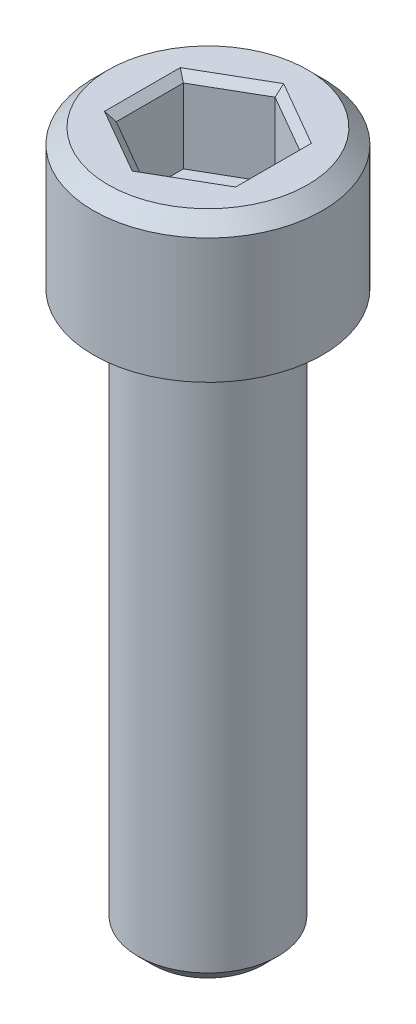
ISO-10303-21;
HEADER;
FILE_DESCRIPTION(('STEP AP214'),'2;1');
FILE_NAME('part.step','',(''),(''),'','','');
FILE_SCHEMA(('AUTOMOTIVE_DESIGN { 1 0 10303 214 1 1 1 1 }'));
ENDSEC;
DATA;
#1=APPLICATION_CONTEXT('core data for automotive mechanical design processes');
#2=APPLICATION_PROTOCOL_DEFINITION('international standard','automotive_design',2000,#1);
#3=PRODUCT_CONTEXT('',#1,'mechanical');
#4=PRODUCT('Part','Part','',(#3));
#5=PRODUCT_RELATED_PRODUCT_CATEGORY('part','',(#4));
#6=PRODUCT_DEFINITION_FORMATION('','',#4);
#7=PRODUCT_DEFINITION_CONTEXT('part definition',#1,'design');
#8=PRODUCT_DEFINITION('design','',#6,#7);
#9=PRODUCT_DEFINITION_SHAPE('','',#8);
#10=(LENGTH_UNIT() NAMED_UNIT(*) SI_UNIT(.MILLI.,.METRE.));
#11=(NAMED_UNIT(*) PLANE_ANGLE_UNIT() SI_UNIT($,.RADIAN.));
#12=(NAMED_UNIT(*) SI_UNIT($,.STERADIAN.) SOLID_ANGLE_UNIT());
#13=UNCERTAINTY_MEASURE_WITH_UNIT(LENGTH_MEASURE(1.E-05),#10,'distance_accuracy_value','');
#14=(GEOMETRIC_REPRESENTATION_CONTEXT(3) GLOBAL_UNCERTAINTY_ASSIGNED_CONTEXT((#13)) GLOBAL_UNIT_ASSIGNED_CONTEXT((#10,
#11,#12)) REPRESENTATION_CONTEXT('',''));
#15=CARTESIAN_POINT('',(0.,0.,0.));
#16=DIRECTION('',(0.,0.,1.));
#17=DIRECTION('',(1.,0.,0.));
#18=AXIS2_PLACEMENT_3D('',#15,#16,#17);
#19=CARTESIAN_POINT('',(0.,-4.77520000000009,0.));
#20=DIRECTION('',(0.,1.,0.));
#21=DIRECTION('',(0.,0.,1.));
#22=AXIS2_PLACEMENT_3D('',#19,#20,#21);
#23=CYLINDRICAL_SURFACE('',#22,3.9116);
#24=CARTESIAN_POINT('',(0.,-0.507999999965141,0.));
#25=DIRECTION('',(0.,1.,0.));
#26=DIRECTION('',(0.,0.,1.));
#27=AXIS2_PLACEMENT_3D('',#24,#25,#26);
#28=CIRCLE('',#27,3.9116);
#29=CARTESIAN_POINT('',(0.,-0.507999999965141,3.9116));
#30=VERTEX_POINT('',#29);
#31=EDGE_CURVE('E162',#30,#30,#28,.F.);
#32=ORIENTED_EDGE('',*,*,#31,.T.);
#33=EDGE_LOOP('',(#32));
#34=FACE_BOUND('',#33,.T.);
#35=CARTESIAN_POINT('',(0.,-4.77520000000009,0.));
#36=DIRECTION('',(0.,1.,0.));
#37=DIRECTION('',(0.,0.,1.));
#38=AXIS2_PLACEMENT_3D('',#35,#36,#37);
#39=CIRCLE('',#38,3.9116);
#40=CARTESIAN_POINT('',(0.,-4.77520000000009,3.9116));
#41=VERTEX_POINT('',#40);
#42=EDGE_CURVE('E138',#41,#41,#39,.T.);
#43=ORIENTED_EDGE('',*,*,#42,.T.);
#44=EDGE_LOOP('',(#43));
#45=FACE_BOUND('',#44,.T.);
#46=ADVANCED_FACE('F32',(#34,#45),#23,.T.);
#47=CARTESIAN_POINT('',(-3.9116,-4.77520000000009,0.));
#48=DIRECTION('',(0.,-1.,0.));
#49=DIRECTION('',(0.,0.,-1.));
#50=AXIS2_PLACEMENT_3D('',#47,#48,#49);
#51=PLANE('',#50);
#52=CARTESIAN_POINT('',(0.,-4.77520000000009,0.));
#53=DIRECTION('',(0.,-1.,0.));
#54=DIRECTION('',(0.,0.,-1.));
#55=AXIS2_PLACEMENT_3D('',#52,#53,#54);
#56=CIRCLE('',#55,2.3876);
#57=CARTESIAN_POINT('',(0.,-4.77520000000009,2.3876));
#58=VERTEX_POINT('',#57);
#59=EDGE_CURVE('E148',#58,#58,#56,.T.);
#60=ORIENTED_EDGE('',*,*,#59,.F.);
#61=EDGE_LOOP('',(#60));
#62=FACE_BOUND('',#61,.T.);
#63=ORIENTED_EDGE('',*,*,#42,.F.);
#64=EDGE_LOOP('',(#63));
#65=FACE_BOUND('',#64,.T.);
#66=ADVANCED_FACE('F236',(#62,#65),#51,.T.);
#67=CARTESIAN_POINT('',(0.,0.,0.));
#68=DIRECTION('',(0.,1.,0.));
#69=DIRECTION('',(0.,0.,1.));
#70=AXIS2_PLACEMENT_3D('',#67,#68,#69);
#71=PLANE('',#70);
#72=DIRECTION('',(-0.866025403784438,0.,0.500000000000001));
#73=VECTOR('',#72,1.);
#74=CARTESIAN_POINT('',(0.126999999999997,0.,2.51132933256124));
#75=LINE('',#74,#73);
#76=CARTESIAN_POINT('',(2.23837499926705,0.,1.29232640837416));
#77=VERTEX_POINT('',#76);
#78=CARTESIAN_POINT('',(0.,0.,2.58465281674831));
#79=VERTEX_POINT('',#78);
#80=EDGE_CURVE('E176',#77,#79,#75,.T.);
#81=ORIENTED_EDGE('',*,*,#80,.T.);
#82=DIRECTION('',(-0.866025403784439,0.,-0.5));
#83=VECTOR('',#82,1.);
#84=CARTESIAN_POINT('',(-2.11137499926705,0.,1.36564989256124));
#85=LINE('',#84,#83);
#86=CARTESIAN_POINT('',(-2.23837499926705,0.,1.29232640837416));
#87=VERTEX_POINT('',#86);
#88=EDGE_CURVE('E178',#79,#87,#85,.T.);
#89=ORIENTED_EDGE('',*,*,#88,.T.);
#90=DIRECTION('',(0.,0.,-1.));
#91=VECTOR('',#90,1.);
#92=CARTESIAN_POINT('',(-2.23837499926705,0.,-1.14567944));
#93=LINE('',#92,#91);
#94=CARTESIAN_POINT('',(-2.23837499926705,0.,-1.29232640837416));
#95=VERTEX_POINT('',#94);
#96=EDGE_CURVE('E168',#87,#95,#93,.T.);
#97=ORIENTED_EDGE('',*,*,#96,.T.);
#98=DIRECTION('',(0.866025403784439,0.,-0.5));
#99=VECTOR('',#98,1.);
#100=CARTESIAN_POINT('',(-0.126999999999994,0.,-2.51132933256124));
#101=LINE('',#100,#99);
#102=CARTESIAN_POINT('',(0.,0.,-2.58465281674832));
#103=VERTEX_POINT('',#102);
#104=EDGE_CURVE('E170',#95,#103,#101,.T.);
#105=ORIENTED_EDGE('',*,*,#104,.T.);
#106=DIRECTION('',(0.866025403784439,0.,0.5));
#107=VECTOR('',#106,1.);
#108=CARTESIAN_POINT('',(2.11137499926705,0.,-1.36564989256124));
#109=LINE('',#108,#107);
#110=CARTESIAN_POINT('',(2.23837499926705,0.,-1.29232640837416));
#111=VERTEX_POINT('',#110);
#112=EDGE_CURVE('E172',#103,#111,#109,.T.);
#113=ORIENTED_EDGE('',*,*,#112,.T.);
#114=DIRECTION('',(0.,0.,1.));
#115=VECTOR('',#114,1.);
#116=CARTESIAN_POINT('',(2.23837499926705,0.,1.14567944));
#117=LINE('',#116,#115);
#118=EDGE_CURVE('E174',#111,#77,#117,.T.);
#119=ORIENTED_EDGE('',*,*,#118,.T.);
#120=EDGE_LOOP('',(#81,#89,#97,#105,#113,#119));
#121=FACE_BOUND('',#120,.T.);
#122=CARTESIAN_POINT('',(0.,0.,0.));
#123=DIRECTION('',(0.,1.,0.));
#124=DIRECTION('',(0.,0.,1.));
#125=AXIS2_PLACEMENT_3D('',#122,#123,#124);
#126=CIRCLE('',#125,3.40360000003486);
#127=CARTESIAN_POINT('',(0.,0.,3.40360000003486));
#128=VERTEX_POINT('',#127);
#129=EDGE_CURVE('E159',#128,#128,#126,.T.);
#130=ORIENTED_EDGE('',*,*,#129,.T.);
#131=EDGE_LOOP('',(#130));
#132=FACE_BOUND('',#131,.T.);
#133=ADVANCED_FACE('F242',(#121,#132),#71,.T.);
#134=CARTESIAN_POINT('',(0.,-23.8252000000001,0.));
#135=DIRECTION('',(0.,1.,0.));
#136=DIRECTION('',(0.,0.,1.));
#137=AXIS2_PLACEMENT_3D('',#134,#135,#136);
#138=CYLINDRICAL_SURFACE('',#137,2.3876);
#139=CARTESIAN_POINT('',(0.,-23.317200000035,0.));
#140=DIRECTION('',(0.,-1.,0.));
#141=DIRECTION('',(0.,0.,-1.));
#142=AXIS2_PLACEMENT_3D('',#139,#140,#141);
#143=CIRCLE('',#142,2.3876);
#144=CARTESIAN_POINT('',(0.,-23.317200000035,2.3876));
#145=VERTEX_POINT('',#144);
#146=EDGE_CURVE('E156',#145,#145,#143,.F.);
#147=CARTESIAN_POINT('',(0.,-23.317200000035,2.3876));
#148=CARTESIAN_POINT('',(0.,-23.1240541667013,2.3876));
#149=CARTESIAN_POINT('',(0.,-22.9309083333676,2.3876));
#150=CARTESIAN_POINT('',(0.,-22.5446166667002,2.3876));
#151=CARTESIAN_POINT('',(0.,-22.3514708333665,2.3876));
#152=CARTESIAN_POINT('',(0.,-21.9651791666991,2.3876));
#153=CARTESIAN_POINT('',(0.,-21.7720333333654,2.3876));
#154=CARTESIAN_POINT('',(0.,-21.385741666698,2.3876));
#155=CARTESIAN_POINT('',(0.,-21.1925958333643,2.3876));
#156=CARTESIAN_POINT('',(0.,-20.8063041666969,2.3876));
#157=CARTESIAN_POINT('',(0.,-20.6131583333632,2.3876));
#158=CARTESIAN_POINT('',(0.,-20.2268666666958,2.3876));
#159=CARTESIAN_POINT('',(0.,-20.0337208333621,2.3876));
#160=CARTESIAN_POINT('',(0.,-19.6474291666947,2.3876));
#161=CARTESIAN_POINT('',(0.,-19.454283333361,2.3876));
#162=CARTESIAN_POINT('',(0.,-19.0679916666936,2.3876));
#163=CARTESIAN_POINT('',(0.,-18.8748458333599,2.3876));
#164=CARTESIAN_POINT('',(0.,-18.4885541666925,2.3876));
#165=CARTESIAN_POINT('',(0.,-18.2954083333588,2.3876));
#166=CARTESIAN_POINT('',(0.,-17.9091166666915,2.3876));
#167=CARTESIAN_POINT('',(0.,-17.7159708333578,2.3876));
#168=CARTESIAN_POINT('',(0.,-17.3296791666904,2.3876));
#169=CARTESIAN_POINT('',(0.,-17.1365333333567,2.3876));
#170=CARTESIAN_POINT('',(0.,-16.7502416666893,2.3876));
#171=CARTESIAN_POINT('',(0.,-16.5570958333556,2.3876));
#172=CARTESIAN_POINT('',(0.,-16.1708041666882,2.3876));
#173=CARTESIAN_POINT('',(0.,-15.9776583333545,2.3876));
#174=CARTESIAN_POINT('',(0.,-15.5913666666871,2.3876));
#175=CARTESIAN_POINT('',(0.,-15.3982208333534,2.3876));
#176=CARTESIAN_POINT('',(0.,-15.011929166686,2.3876));
#177=CARTESIAN_POINT('',(0.,-14.8187833333523,2.3876));
#178=CARTESIAN_POINT('',(0.,-14.4324916666849,2.3876));
#179=CARTESIAN_POINT('',(0.,-14.2393458333512,2.3876));
#180=CARTESIAN_POINT('',(0.,-13.8530541666838,2.3876));
#181=CARTESIAN_POINT('',(0.,-13.6599083333501,2.3876));
#182=CARTESIAN_POINT('',(0.,-13.2736166666827,2.3876));
#183=CARTESIAN_POINT('',(0.,-13.080470833349,2.3876));
#184=CARTESIAN_POINT('',(0.,-12.6941791666817,2.3876));
#185=CARTESIAN_POINT('',(0.,-12.501033333348,2.3876));
#186=CARTESIAN_POINT('',(0.,-12.1147416666806,2.3876));
#187=CARTESIAN_POINT('',(0.,-11.9215958333469,2.3876));
#188=CARTESIAN_POINT('',(0.,-11.5353041666795,2.3876));
#189=CARTESIAN_POINT('',(0.,-11.3421583333458,2.3876));
#190=CARTESIAN_POINT('',(0.,-10.9558666666784,2.3876));
#191=CARTESIAN_POINT('',(0.,-10.7627208333447,2.3876));
#192=CARTESIAN_POINT('',(0.,-10.3764291666773,2.3876));
#193=CARTESIAN_POINT('',(0.,-10.1832833333436,2.3876));
#194=CARTESIAN_POINT('',(0.,-9.7969916666762,2.3876));
#195=CARTESIAN_POINT('',(0.,-9.6038458333425,2.3876));
#196=CARTESIAN_POINT('',(0.,-9.21755416667511,2.3876));
#197=CARTESIAN_POINT('',(0.,-9.02440833334141,2.3876));
#198=CARTESIAN_POINT('',(0.,-8.63811666667402,2.3876));
#199=CARTESIAN_POINT('',(0.,-8.44497083334032,2.3876));
#200=CARTESIAN_POINT('',(0.,-8.05867916667293,2.3876));
#201=CARTESIAN_POINT('',(0.,-7.86553333333924,2.3876));
#202=CARTESIAN_POINT('',(0.,-7.47924166667184,2.3876));
#203=CARTESIAN_POINT('',(0.,-7.28609583333815,2.3876));
#204=CARTESIAN_POINT('',(0.,-6.89980416667075,2.3876));
#205=CARTESIAN_POINT('',(0.,-6.70665833333706,2.3876));
#206=CARTESIAN_POINT('',(0.,-6.32036666666966,2.3876));
#207=CARTESIAN_POINT('',(0.,-6.12722083333597,2.3876));
#208=CARTESIAN_POINT('',(0.,-5.74092916666857,2.3876));
#209=CARTESIAN_POINT('',(0.,-5.54778333333488,2.3876));
#210=CARTESIAN_POINT('',(0.,-5.16149166666748,2.3876));
#211=CARTESIAN_POINT('',(0.,-4.96834583333379,2.3876));
#212=CARTESIAN_POINT('',(0.,-4.77520000000009,2.3876));
#213=B_SPLINE_CURVE_WITH_KNOTS('',3,(#147,#148,#149,#150,#151,#152,#153,#154,#155,#156,#157,
#158,#159,#160,#161,#162,#163,#164,#165,#166,#167,#168,#169,#170,#171,#172,#173,#174,#175,#176,
#177,#178,#179,#180,#181,#182,#183,#184,#185,#186,#187,#188,#189,#190,#191,#192,#193,#194,#195,
#196,#197,#198,#199,#200,#201,#202,#203,#204,#205,#206,#207,#208,#209,#210,#211,#212),
.UNSPECIFIED.,.F.,.F.,(4,2,2,2,2,2,2,2,2,2,2,2,2,2,2,2,2,2,2,2,2,2,2,2,2,2,2,2,2,2,2,2,4),(0.,
0.579437500001088,1.15887500000218,1.73831250000327,2.31775000000436,2.89718750000545,
3.47662500000654,4.05606250000762,4.63550000000872,5.2149375000098,5.79437500001089,
6.37381250001199,6.95325000001307,7.53268750001416,8.11212500001525,8.69156250001634,
9.27100000001743,9.85043750001852,10.4298750000196,11.0093125000207,11.5887500000218,
12.1681875000229,12.747625000024,13.3270625000251,13.9065000000261,14.4859375000272,
15.0653750000283,15.6448125000294,16.2242500000305,16.8036875000316,17.3831250000327,
17.9625625000338,18.5420000000349),.UNSPECIFIED.);
#214=EDGE_CURVE('BSEAM330',#145,#58,#213,.T.);
#215=ORIENTED_EDGE('',*,*,#146,.T.);
#216=ORIENTED_EDGE('',*,*,#59,.T.);
#217=ORIENTED_EDGE('',*,*,#214,.T.);
#218=ORIENTED_EDGE('',*,*,#214,.F.);
#219=EDGE_LOOP('',(#215,#217,#216,#218));
#220=FACE_BOUND('',#219,.T.);
#221=ADVANCED_FACE('F330',(#220),#138,.T.);
#222=CARTESIAN_POINT('',(0.,-23.8252000000001,0.));
#223=DIRECTION('',(0.,-1.,0.));
#224=DIRECTION('',(0.,0.,-1.));
#225=AXIS2_PLACEMENT_3D('',#222,#223,#224);
#226=PLANE('',#225);
#227=CARTESIAN_POINT('',(0.,-23.8252000000001,0.));
#228=DIRECTION('',(0.,-1.,0.));
#229=DIRECTION('',(0.,0.,-1.));
#230=AXIS2_PLACEMENT_3D('',#227,#228,#229);
#231=CIRCLE('',#230,1.87960000003487);
#232=CARTESIAN_POINT('',(0.,-23.8252000000001,-1.87960000003487));
#233=VERTEX_POINT('',#232);
#234=EDGE_CURVE('E151',#233,#233,#231,.T.);
#235=ORIENTED_EDGE('',*,*,#234,.T.);
#236=EDGE_LOOP('',(#235));
#237=FACE_BOUND('',#236,.T.);
#238=ADVANCED_FACE('F232',(#237),#226,.T.);
#239=CARTESIAN_POINT('',(0.,-2.79399999999996,-2.29135888));
#240=DIRECTION('',(-0.5,0.,-0.866025403784439));
#241=DIRECTION('',(-0.866025403784439,0.,0.5));
#242=AXIS2_PLACEMENT_3D('',#239,#240,#241);
#243=PLANE('',#242);
#244=DIRECTION('',(0.,1.,0.));
#245=VECTOR('',#244,1.);
#246=CARTESIAN_POINT('',(0.,-2.79399999999996,-2.29135888));
#247=LINE('',#246,#245);
#248=CARTESIAN_POINT('',(0.,-2.79399999999996,-2.29135888));
#249=VERTEX_POINT('',#248);
#250=CARTESIAN_POINT('',(0.,-0.253999999999983,-2.29135888));
#251=VERTEX_POINT('',#250);
#252=EDGE_CURVE('E136',#249,#251,#247,.T.);
#253=ORIENTED_EDGE('',*,*,#252,.T.);
#254=DIRECTION('',(-0.866025403784439,0.,0.5));
#255=VECTOR('',#254,1.);
#256=CARTESIAN_POINT('',(-1.98437499926706,-0.253999999999984,-1.14567944));
#257=LINE('',#256,#255);
#258=CARTESIAN_POINT('',(-1.98437499926706,-0.253999999999983,-1.14567944));
#259=VERTEX_POINT('',#258);
#260=EDGE_CURVE('E41',#251,#259,#257,.T.);
#261=ORIENTED_EDGE('',*,*,#260,.T.);
#262=DIRECTION('',(0.,1.,0.));
#263=VECTOR('',#262,1.);
#264=CARTESIAN_POINT('',(-1.98437499926706,-2.79399999999996,-1.14567944));
#265=LINE('',#264,#263);
#266=CARTESIAN_POINT('',(-1.98437499926706,-2.79399999999996,-1.14567944));
#267=VERTEX_POINT('',#266);
#268=EDGE_CURVE('E102',#267,#259,#265,.T.);
#269=ORIENTED_EDGE('',*,*,#268,.F.);
#270=DIRECTION('',(-0.866025403784439,0.,0.5));
#271=VECTOR('',#270,1.);
#272=CARTESIAN_POINT('',(0.,-2.79399999999996,-2.29135888));
#273=LINE('',#272,#271);
#274=EDGE_CURVE('E106',#249,#267,#273,.T.);
#275=ORIENTED_EDGE('',*,*,#274,.F.);
#276=EDGE_LOOP('',(#253,#261,#269,#275));
#277=FACE_BOUND('',#276,.T.);
#278=ADVANCED_FACE('F104',(#277),#243,.F.);
#279=CARTESIAN_POINT('',(1.98437499926706,-2.79399999999996,-1.14567944));
#280=DIRECTION('',(0.5,0.,-0.866025403784439));
#281=DIRECTION('',(-0.866025403784439,0.,-0.5));
#282=AXIS2_PLACEMENT_3D('',#279,#280,#281);
#283=PLANE('',#282);
#284=DIRECTION('',(0.,1.,0.));
#285=VECTOR('',#284,1.);
#286=CARTESIAN_POINT('',(1.98437499926706,-2.79399999999996,-1.14567944));
#287=LINE('',#286,#285);
#288=CARTESIAN_POINT('',(1.98437499926706,-2.79399999999996,-1.14567944));
#289=VERTEX_POINT('',#288);
#290=CARTESIAN_POINT('',(1.98437499926706,-0.253999999999983,-1.14567944));
#291=VERTEX_POINT('',#290);
#292=EDGE_CURVE('E139',#289,#291,#287,.T.);
#293=ORIENTED_EDGE('',*,*,#292,.T.);
#294=DIRECTION('',(-0.866025403784439,0.,-0.5));
#295=VECTOR('',#294,1.);
#296=CARTESIAN_POINT('',(0.,-0.253999999999983,-2.29135888));
#297=LINE('',#296,#295);
#298=EDGE_CURVE('E56',#291,#251,#297,.T.);
#299=ORIENTED_EDGE('',*,*,#298,.T.);
#300=ORIENTED_EDGE('',*,*,#252,.F.);
#301=DIRECTION('',(-0.866025403784439,0.,-0.5));
#302=VECTOR('',#301,1.);
#303=CARTESIAN_POINT('',(1.98437499926706,-2.79399999999996,-1.14567944));
#304=LINE('',#303,#302);
#305=EDGE_CURVE('E111',#289,#249,#304,.T.);
#306=ORIENTED_EDGE('',*,*,#305,.F.);
#307=EDGE_LOOP('',(#293,#299,#300,#306));
#308=FACE_BOUND('',#307,.T.);
#309=ADVANCED_FACE('F224',(#308),#283,.F.);
#310=CARTESIAN_POINT('',(1.98437499926706,-2.79399999999996,1.14567944));
#311=DIRECTION('',(1.,0.,0.));
#312=DIRECTION('',(0.,0.,-1.));
#313=AXIS2_PLACEMENT_3D('',#310,#311,#312);
#314=PLANE('',#313);
#315=DIRECTION('',(0.,1.,0.));
#316=VECTOR('',#315,1.);
#317=CARTESIAN_POINT('',(1.98437499926706,-2.79399999999996,1.14567944));
#318=LINE('',#317,#316);
#319=CARTESIAN_POINT('',(1.98437499926706,-2.79399999999996,1.14567944));
#320=VERTEX_POINT('',#319);
#321=CARTESIAN_POINT('',(1.98437499926706,-0.253999999999983,1.14567944));
#322=VERTEX_POINT('',#321);
#323=EDGE_CURVE('E141',#320,#322,#318,.T.);
#324=ORIENTED_EDGE('',*,*,#323,.T.);
#325=DIRECTION('',(0.,0.,-1.));
#326=VECTOR('',#325,1.);
#327=CARTESIAN_POINT('',(1.98437499926706,-0.253999999999983,-1.14567944));
#328=LINE('',#327,#326);
#329=EDGE_CURVE('E183',#322,#291,#328,.T.);
#330=ORIENTED_EDGE('',*,*,#329,.T.);
#331=ORIENTED_EDGE('',*,*,#292,.F.);
#332=DIRECTION('',(0.,0.,-1.));
#333=VECTOR('',#332,1.);
#334=CARTESIAN_POINT('',(1.98437499926706,-2.79399999999996,1.14567944));
#335=LINE('',#334,#333);
#336=EDGE_CURVE('E133',#320,#289,#335,.T.);
#337=ORIENTED_EDGE('',*,*,#336,.F.);
#338=EDGE_LOOP('',(#324,#330,#331,#337));
#339=FACE_BOUND('',#338,.T.);
#340=ADVANCED_FACE('F223',(#339),#314,.F.);
#341=CARTESIAN_POINT('',(0.,-2.79399999999996,2.29135888));
#342=DIRECTION('',(0.500000000000001,0.,0.866025403784438));
#343=DIRECTION('',(0.866025403784438,0.,-0.500000000000001));
#344=AXIS2_PLACEMENT_3D('',#341,#342,#343);
#345=PLANE('',#344);
#346=DIRECTION('',(0.,1.,0.));
#347=VECTOR('',#346,1.);
#348=CARTESIAN_POINT('',(0.,-2.79399999999996,2.29135888));
#349=LINE('',#348,#347);
#350=CARTESIAN_POINT('',(0.,-2.79399999999996,2.29135888));
#351=VERTEX_POINT('',#350);
#352=CARTESIAN_POINT('',(0.,-0.253999999999983,2.29135888));
#353=VERTEX_POINT('',#352);
#354=EDGE_CURVE('E144',#351,#353,#349,.T.);
#355=ORIENTED_EDGE('',*,*,#354,.T.);
#356=DIRECTION('',(0.866025403784438,0.,-0.500000000000001));
#357=VECTOR('',#356,1.);
#358=CARTESIAN_POINT('',(1.98437499926706,-0.253999999999984,1.14567944));
#359=LINE('',#358,#357);
#360=EDGE_CURVE('E181',#353,#322,#359,.T.);
#361=ORIENTED_EDGE('',*,*,#360,.T.);
#362=ORIENTED_EDGE('',*,*,#323,.F.);
#363=DIRECTION('',(0.866025403784438,0.,-0.500000000000001));
#364=VECTOR('',#363,1.);
#365=CARTESIAN_POINT('',(0.,-2.79399999999996,2.29135888));
#366=LINE('',#365,#364);
#367=EDGE_CURVE('E130',#351,#320,#366,.T.);
#368=ORIENTED_EDGE('',*,*,#367,.F.);
#369=EDGE_LOOP('',(#355,#361,#362,#368));
#370=FACE_BOUND('',#369,.T.);
#371=ADVANCED_FACE('F220',(#370),#345,.F.);
#372=CARTESIAN_POINT('',(-1.98437499926706,-2.79399999999996,1.14567944));
#373=DIRECTION('',(-0.5,0.,0.866025403784439));
#374=DIRECTION('',(0.866025403784439,0.,0.5));
#375=AXIS2_PLACEMENT_3D('',#372,#373,#374);
#376=PLANE('',#375);
#377=DIRECTION('',(0.,1.,0.));
#378=VECTOR('',#377,1.);
#379=CARTESIAN_POINT('',(-1.98437499926706,-2.79399999999996,1.14567944));
#380=LINE('',#379,#378);
#381=CARTESIAN_POINT('',(-1.98437499926706,-2.79399999999996,1.14567944));
#382=VERTEX_POINT('',#381);
#383=CARTESIAN_POINT('',(-1.98437499926706,-0.253999999999983,1.14567944));
#384=VERTEX_POINT('',#383);
#385=EDGE_CURVE('E110',#382,#384,#380,.T.);
#386=ORIENTED_EDGE('',*,*,#385,.T.);
#387=DIRECTION('',(0.866025403784439,0.,0.5));
#388=VECTOR('',#387,1.);
#389=CARTESIAN_POINT('',(0.,-0.253999999999984,2.29135888));
#390=LINE('',#389,#388);
#391=EDGE_CURVE('E165',#384,#353,#390,.T.);
#392=ORIENTED_EDGE('',*,*,#391,.T.);
#393=ORIENTED_EDGE('',*,*,#354,.F.);
#394=DIRECTION('',(0.866025403784439,0.,0.5));
#395=VECTOR('',#394,1.);
#396=CARTESIAN_POINT('',(-1.98437499926706,-2.79399999999996,1.14567944));
#397=LINE('',#396,#395);
#398=EDGE_CURVE('E120',#382,#351,#397,.T.);
#399=ORIENTED_EDGE('',*,*,#398,.F.);
#400=EDGE_LOOP('',(#386,#392,#393,#399));
#401=FACE_BOUND('',#400,.T.);
#402=ADVANCED_FACE('F216',(#401),#376,.F.);
#403=CARTESIAN_POINT('',(-1.98437499926706,-2.79399999999996,-1.14567944));
#404=DIRECTION('',(-1.,0.,0.));
#405=DIRECTION('',(0.,0.,1.));
#406=AXIS2_PLACEMENT_3D('',#403,#404,#405);
#407=PLANE('',#406);
#408=ORIENTED_EDGE('',*,*,#268,.T.);
#409=DIRECTION('',(0.,0.,1.));
#410=VECTOR('',#409,1.);
#411=CARTESIAN_POINT('',(-1.98437499926706,-0.253999999999983,1.14567944));
#412=LINE('',#411,#410);
#413=EDGE_CURVE('E11',#259,#384,#412,.T.);
#414=ORIENTED_EDGE('',*,*,#413,.T.);
#415=ORIENTED_EDGE('',*,*,#385,.F.);
#416=DIRECTION('',(0.,0.,1.));
#417=VECTOR('',#416,1.);
#418=CARTESIAN_POINT('',(-1.98437499926706,-2.79399999999996,-1.14567944));
#419=LINE('',#418,#417);
#420=EDGE_CURVE('E114',#267,#382,#419,.T.);
#421=ORIENTED_EDGE('',*,*,#420,.F.);
#422=EDGE_LOOP('',(#408,#414,#415,#421));
#423=FACE_BOUND('',#422,.T.);
#424=ADVANCED_FACE('F115',(#423),#407,.F.);
#425=CARTESIAN_POINT('',(0.,-2.79399999999996,0.));
#426=DIRECTION('',(0.,1.,0.));
#427=DIRECTION('',(0.,0.,1.));
#428=AXIS2_PLACEMENT_3D('',#425,#426,#427);
#429=PLANE('',#428);
#430=ORIENTED_EDGE('',*,*,#274,.T.);
#431=ORIENTED_EDGE('',*,*,#420,.T.);
#432=ORIENTED_EDGE('',*,*,#398,.T.);
#433=ORIENTED_EDGE('',*,*,#367,.T.);
#434=ORIENTED_EDGE('',*,*,#336,.T.);
#435=ORIENTED_EDGE('',*,*,#305,.T.);
#436=EDGE_LOOP('',(#430,#431,#432,#433,#434,#435));
#437=FACE_BOUND('',#436,.T.);
#438=ADVANCED_FACE('F122',(#437),#429,.T.);
#439=CARTESIAN_POINT('',(0.,-23.8252000000001,0.));
#440=DIRECTION('',(0.,1.,0.));
#441=DIRECTION('',(0.,0.,1.));
#442=AXIS2_PLACEMENT_3D('',#439,#440,#441);
#443=CONICAL_SURFACE('',#442,1.87960000003487,0.785398163397445);
#444=ORIENTED_EDGE('',*,*,#146,.F.);
#445=EDGE_LOOP('',(#444));
#446=FACE_BOUND('',#445,.T.);
#447=ORIENTED_EDGE('',*,*,#234,.F.);
#448=EDGE_LOOP('',(#447));
#449=FACE_BOUND('',#448,.T.);
#450=ADVANCED_FACE('F248',(#446,#449),#443,.T.);
#451=CARTESIAN_POINT('',(0.,0.,0.));
#452=DIRECTION('',(0.,-1.,0.));
#453=DIRECTION('',(0.,0.,-1.));
#454=AXIS2_PLACEMENT_3D('',#451,#452,#453);
#455=CONICAL_SURFACE('',#454,3.40360000003486,0.785398163397446);
#456=ORIENTED_EDGE('',*,*,#31,.F.);
#457=EDGE_LOOP('',(#456));
#458=FACE_BOUND('',#457,.T.);
#459=ORIENTED_EDGE('',*,*,#129,.F.);
#460=EDGE_LOOP('',(#459));
#461=FACE_BOUND('',#460,.T.);
#462=ADVANCED_FACE('F251',(#458,#461),#455,.T.);
#463=CARTESIAN_POINT('',(1.98437499926706,-0.253999999999983,-1.14567944));
#464=DIRECTION('',(-0.353553390593271,0.707106781186552,0.61237243569579));
#465=DIRECTION('',(0.866025403784439,0.,0.5));
#466=AXIS2_PLACEMENT_3D('',#463,#464,#465);
#467=PLANE('',#466);
#468=DIRECTION('',(0.65465367070798,0.654653670707973,-0.377964473009231));
#469=VECTOR('',#468,1.);
#470=CARTESIAN_POINT('',(1.41741071376218,-0.820964285504858,-0.818342457142852));
#471=LINE('',#470,#469);
#472=EDGE_CURVE('E127',#111,#291,#471,.F.);
#473=ORIENTED_EDGE('',*,*,#472,.F.);
#474=ORIENTED_EDGE('',*,*,#112,.F.);
#475=DIRECTION('',(0.,0.654653670707972,-0.755928946018459));
#476=VECTOR('',#475,1.);
#477=CARTESIAN_POINT('',(0.,-0.820964285504859,-1.6366849142857));
#478=LINE('',#477,#476);
#479=EDGE_CURVE('E36',#251,#103,#478,.T.);
#480=ORIENTED_EDGE('',*,*,#479,.F.);
#481=ORIENTED_EDGE('',*,*,#298,.F.);
#482=EDGE_LOOP('',(#473,#474,#480,#481));
#483=FACE_BOUND('',#482,.T.);
#484=ADVANCED_FACE('F34',(#483),#467,.T.);
#485=CARTESIAN_POINT('',(0.,-0.253999999999983,-2.29135888));
#486=DIRECTION('',(0.353553390593271,0.707106781186553,0.61237243569579));
#487=DIRECTION('',(0.866025403784439,0.,-0.5));
#488=AXIS2_PLACEMENT_3D('',#485,#486,#487);
#489=PLANE('',#488);
#490=ORIENTED_EDGE('',*,*,#479,.T.);
#491=ORIENTED_EDGE('',*,*,#104,.F.);
#492=DIRECTION('',(-0.654653670707981,0.654653670707972,-0.377964473009231));
#493=VECTOR('',#492,1.);
#494=CARTESIAN_POINT('',(-1.41741071376218,-0.820964285504854,-0.818342457142853));
#495=LINE('',#494,#493);
#496=EDGE_CURVE('E194',#259,#95,#495,.T.);
#497=ORIENTED_EDGE('',*,*,#496,.F.);
#498=ORIENTED_EDGE('',*,*,#260,.F.);
#499=EDGE_LOOP('',(#490,#491,#497,#498));
#500=FACE_BOUND('',#499,.T.);
#501=ADVANCED_FACE('F208',(#500),#489,.T.);
#502=CARTESIAN_POINT('',(1.98437499926706,-0.253999999999983,1.14567944));
#503=DIRECTION('',(-0.707106781186544,0.707106781186551,0.));
#504=DIRECTION('',(0.,0.,1.));
#505=AXIS2_PLACEMENT_3D('',#502,#503,#504);
#506=PLANE('',#505);
#507=ORIENTED_EDGE('',*,*,#472,.T.);
#508=ORIENTED_EDGE('',*,*,#329,.F.);
#509=DIRECTION('',(0.65465367070798,0.654653670707972,0.377964473009231));
#510=VECTOR('',#509,1.);
#511=CARTESIAN_POINT('',(1.41741071376218,-0.820964285504853,0.818342457142854));
#512=LINE('',#511,#510);
#513=EDGE_CURVE('E191',#77,#322,#512,.F.);
#514=ORIENTED_EDGE('',*,*,#513,.F.);
#515=ORIENTED_EDGE('',*,*,#118,.F.);
#516=EDGE_LOOP('',(#507,#508,#514,#515));
#517=FACE_BOUND('',#516,.T.);
#518=ADVANCED_FACE('F201',(#517),#506,.T.);
#519=CARTESIAN_POINT('',(-1.98437499926706,-0.253999999999983,-1.14567944));
#520=DIRECTION('',(0.707106781186543,0.707106781186552,0.));
#521=DIRECTION('',(0.,0.,-1.));
#522=AXIS2_PLACEMENT_3D('',#519,#520,#521);
#523=PLANE('',#522);
#524=ORIENTED_EDGE('',*,*,#496,.T.);
#525=ORIENTED_EDGE('',*,*,#96,.F.);
#526=DIRECTION('',(0.654653670707981,-0.654653670707972,-0.37796447300923));
#527=VECTOR('',#526,1.);
#528=CARTESIAN_POINT('',(-1.98437499926706,-0.253999999999983,1.14567944));
#529=LINE('',#528,#527);
#530=EDGE_CURVE('E189',#384,#87,#529,.F.);
#531=ORIENTED_EDGE('',*,*,#530,.F.);
#532=ORIENTED_EDGE('',*,*,#413,.F.);
#533=EDGE_LOOP('',(#524,#525,#531,#532));
#534=FACE_BOUND('',#533,.T.);
#535=ADVANCED_FACE('F213',(#534),#523,.T.);
#536=CARTESIAN_POINT('',(0.,-0.253999999999983,2.29135888));
#537=DIRECTION('',(-0.353553390593272,0.707106781186553,-0.61237243569579));
#538=DIRECTION('',(-0.866025403784438,0.,0.500000000000001));
#539=AXIS2_PLACEMENT_3D('',#536,#537,#538);
#540=PLANE('',#539);
#541=ORIENTED_EDGE('',*,*,#513,.T.);
#542=ORIENTED_EDGE('',*,*,#360,.F.);
#543=DIRECTION('',(0.,0.654653670707972,0.755928946018459));
#544=VECTOR('',#543,1.);
#545=CARTESIAN_POINT('',(0.,-0.820964285504857,1.63668491428571));
#546=LINE('',#545,#544);
#547=EDGE_CURVE('E187',#79,#353,#546,.F.);
#548=ORIENTED_EDGE('',*,*,#547,.F.);
#549=ORIENTED_EDGE('',*,*,#80,.F.);
#550=EDGE_LOOP('',(#541,#542,#548,#549));
#551=FACE_BOUND('',#550,.T.);
#552=ADVANCED_FACE('F259',(#551),#540,.T.);
#553=CARTESIAN_POINT('',(-1.98437499926706,-0.253999999999983,1.14567944));
#554=DIRECTION('',(0.353553390593271,0.707106781186553,-0.61237243569579));
#555=DIRECTION('',(-0.866025403784439,0.,-0.5));
#556=AXIS2_PLACEMENT_3D('',#553,#554,#555);
#557=PLANE('',#556);
#558=ORIENTED_EDGE('',*,*,#530,.T.);
#559=ORIENTED_EDGE('',*,*,#88,.F.);
#560=ORIENTED_EDGE('',*,*,#547,.T.);
#561=ORIENTED_EDGE('',*,*,#391,.F.);
#562=EDGE_LOOP('',(#558,#559,#560,#561));
#563=FACE_BOUND('',#562,.T.);
#564=ADVANCED_FACE('F256',(#563),#557,.T.);
#565=CLOSED_SHELL('',(#46,#66,#133,#221,#238,#278,#309,#340,#371,#402,#424,#438,#450,#462,#484,
#501,#518,#535,#552,#564));
#566=MANIFOLD_SOLID_BREP('B2',#565);
#567=ADVANCED_BREP_SHAPE_REPRESENTATION('',(#18,#566),#14);
#568=SHAPE_DEFINITION_REPRESENTATION(#9,#567);
ENDSEC;
END-ISO-10303-21;
